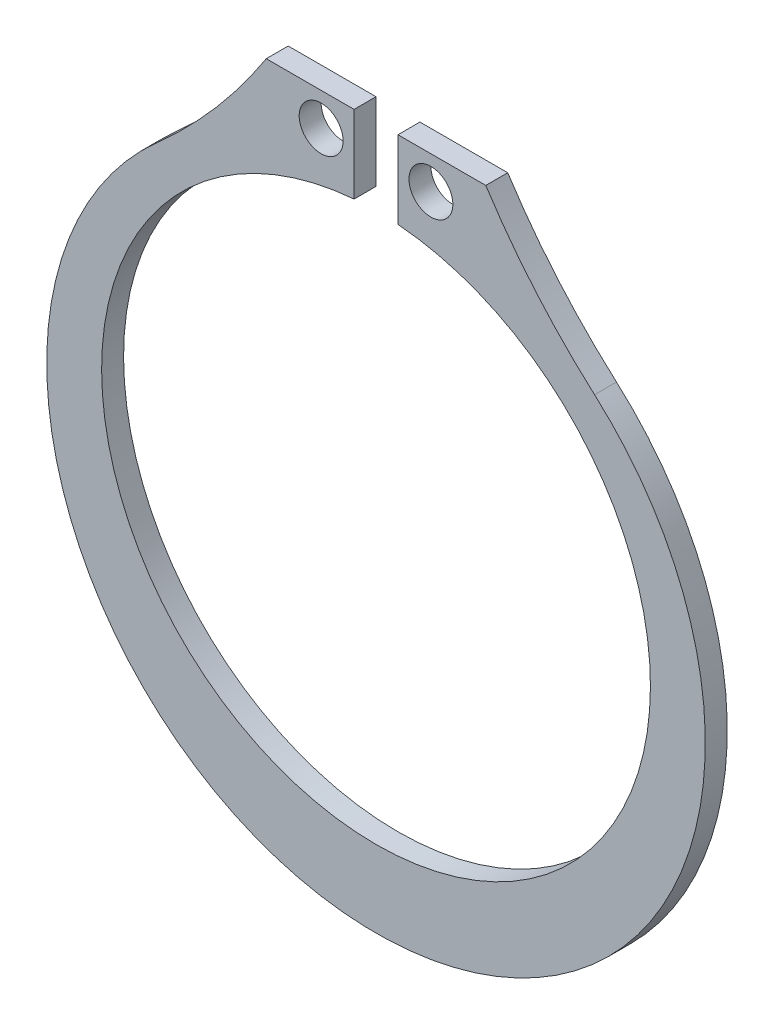
ISO-10303-21;
HEADER;
FILE_DESCRIPTION(('STEP AP214'),'2;1');
FILE_NAME('part.step','',(''),(''),'','','');
FILE_SCHEMA(('AUTOMOTIVE_DESIGN { 1 0 10303 214 1 1 1 1 }'));
ENDSEC;
DATA;
#1=APPLICATION_CONTEXT('core data for automotive mechanical design processes');
#2=APPLICATION_PROTOCOL_DEFINITION('international standard','automotive_design',2000,#1);
#3=PRODUCT_CONTEXT('',#1,'mechanical');
#4=PRODUCT('Part','Part','',(#3));
#5=PRODUCT_RELATED_PRODUCT_CATEGORY('part','',(#4));
#6=PRODUCT_DEFINITION_FORMATION('','',#4);
#7=PRODUCT_DEFINITION_CONTEXT('part definition',#1,'design');
#8=PRODUCT_DEFINITION('design','',#6,#7);
#9=PRODUCT_DEFINITION_SHAPE('','',#8);
#10=(LENGTH_UNIT() NAMED_UNIT(*) SI_UNIT(.MILLI.,.METRE.));
#11=(NAMED_UNIT(*) PLANE_ANGLE_UNIT() SI_UNIT($,.RADIAN.));
#12=(NAMED_UNIT(*) SI_UNIT($,.STERADIAN.) SOLID_ANGLE_UNIT());
#13=UNCERTAINTY_MEASURE_WITH_UNIT(LENGTH_MEASURE(1.E-05),#10,'distance_accuracy_value','');
#14=(GEOMETRIC_REPRESENTATION_CONTEXT(3) GLOBAL_UNCERTAINTY_ASSIGNED_CONTEXT((#13)) GLOBAL_UNIT_ASSIGNED_CONTEXT((#10,
#11,#12)) REPRESENTATION_CONTEXT('',''));
#15=CARTESIAN_POINT('',(0.,0.,0.));
#16=DIRECTION('',(0.,0.,1.));
#17=DIRECTION('',(1.,0.,0.));
#18=AXIS2_PLACEMENT_3D('',#15,#16,#17);
#19=CARTESIAN_POINT('',(-28.5373817339157,32.165475960613,1.));
#20=DIRECTION('',(0.,0.,-1.));
#21=DIRECTION('',(-1.,0.,0.));
#22=AXIS2_PLACEMENT_3D('',#19,#20,#21);
#23=PLANE('',#22);
#24=CARTESIAN_POINT('',(-28.5373817339157,32.165475960613,1.));
#25=DIRECTION('',(0.,0.,-1.));
#26=DIRECTION('',(-1.,0.,0.));
#27=AXIS2_PLACEMENT_3D('',#24,#25,#26);
#28=CIRCLE('',#27,28.);
#29=CARTESIAN_POINT('',(-5.,17.,1.));
#30=VERTEX_POINT('',#29);
#31=CARTESIAN_POINT('',(-9.95490060485432,11.2205148699813,1.));
#32=VERTEX_POINT('',#31);
#33=EDGE_CURVE('E170',#30,#32,#28,.T.);
#34=ORIENTED_EDGE('',*,*,#33,.T.);
#35=CARTESIAN_POINT('',(0.,0.,1.));
#36=DIRECTION('',(0.,0.,1.));
#37=DIRECTION('',(1.,0.,0.));
#38=AXIS2_PLACEMENT_3D('',#35,#36,#37);
#39=CIRCLE('',#38,15.);
#40=CARTESIAN_POINT('',(9.95490060485432,11.2205148699813,1.));
#41=VERTEX_POINT('',#40);
#42=EDGE_CURVE('E106',#32,#41,#39,.T.);
#43=ORIENTED_EDGE('',*,*,#42,.T.);
#44=CARTESIAN_POINT('',(28.5373817339157,32.165475960613,1.));
#45=DIRECTION('',(0.,0.,-1.));
#46=DIRECTION('',(1.,0.,0.));
#47=AXIS2_PLACEMENT_3D('',#44,#45,#46);
#48=CIRCLE('',#47,28.);
#49=CARTESIAN_POINT('',(5.,17.,1.));
#50=VERTEX_POINT('',#49);
#51=EDGE_CURVE('E191',#41,#50,#48,.T.);
#52=ORIENTED_EDGE('',*,*,#51,.T.);
#53=DIRECTION('',(-1.,0.,0.));
#54=VECTOR('',#53,1.);
#55=CARTESIAN_POINT('',(5.,17.,1.));
#56=LINE('',#55,#54);
#57=CARTESIAN_POINT('',(1.,17.,1.));
#58=VERTEX_POINT('',#57);
#59=EDGE_CURVE('E205',#50,#58,#56,.T.);
#60=ORIENTED_EDGE('',*,*,#59,.T.);
#61=DIRECTION('',(0.,-1.,0.));
#62=VECTOR('',#61,1.);
#63=CARTESIAN_POINT('',(1.,17.,1.));
#64=LINE('',#63,#62);
#65=CARTESIAN_POINT('',(0.999999999999999,13.4599357943771,1.));
#66=VERTEX_POINT('',#65);
#67=EDGE_CURVE('E125',#58,#66,#64,.T.);
#68=ORIENTED_EDGE('',*,*,#67,.T.);
#69=CARTESIAN_POINT('',(0.,1.,1.));
#70=DIRECTION('',(0.,0.,-1.));
#71=DIRECTION('',(1.,0.,0.));
#72=AXIS2_PLACEMENT_3D('',#69,#70,#71);
#73=CIRCLE('',#72,12.5);
#74=CARTESIAN_POINT('',(-0.999999999999999,13.4599357943771,1.));
#75=VERTEX_POINT('',#74);
#76=EDGE_CURVE('E119',#66,#75,#73,.T.);
#77=ORIENTED_EDGE('',*,*,#76,.T.);
#78=DIRECTION('',(0.,1.,0.));
#79=VECTOR('',#78,1.);
#80=CARTESIAN_POINT('',(-1.,17.,1.));
#81=LINE('',#80,#79);
#82=CARTESIAN_POINT('',(-1.,17.,1.));
#83=VERTEX_POINT('',#82);
#84=EDGE_CURVE('E123',#75,#83,#81,.T.);
#85=ORIENTED_EDGE('',*,*,#84,.T.);
#86=DIRECTION('',(-1.,0.,0.));
#87=VECTOR('',#86,1.);
#88=CARTESIAN_POINT('',(-5.,17.,1.));
#89=LINE('',#88,#87);
#90=EDGE_CURVE('E63',#83,#30,#89,.T.);
#91=ORIENTED_EDGE('',*,*,#90,.T.);
#92=EDGE_LOOP('',(#34,#43,#52,#60,#68,#77,#85,#91));
#93=FACE_BOUND('',#92,.T.);
#94=CARTESIAN_POINT('',(-2.5,15.5,1.));
#95=DIRECTION('',(0.,0.,1.));
#96=DIRECTION('',(1.,0.,0.));
#97=AXIS2_PLACEMENT_3D('',#94,#95,#96);
#98=CIRCLE('',#97,1.);
#99=CARTESIAN_POINT('',(-1.5,15.5,1.));
#100=VERTEX_POINT('',#99);
#101=EDGE_CURVE('E152',#100,#100,#98,.T.);
#102=ORIENTED_EDGE('',*,*,#101,.F.);
#103=EDGE_LOOP('',(#102));
#104=FACE_BOUND('',#103,.T.);
#105=CARTESIAN_POINT('',(2.5,15.5,1.));
#106=DIRECTION('',(0.,0.,1.));
#107=DIRECTION('',(-1.,0.,0.));
#108=AXIS2_PLACEMENT_3D('',#105,#106,#107);
#109=CIRCLE('',#108,1.);
#110=CARTESIAN_POINT('',(1.5,15.5,1.));
#111=VERTEX_POINT('',#110);
#112=EDGE_CURVE('E219',#111,#111,#109,.T.);
#113=ORIENTED_EDGE('',*,*,#112,.F.);
#114=EDGE_LOOP('',(#113));
#115=FACE_BOUND('',#114,.T.);
#116=ADVANCED_FACE('F45',(#93,#104,#115),#23,.F.);
#117=CARTESIAN_POINT('',(-28.5373817339157,32.165475960613,0.));
#118=DIRECTION('',(0.,0.,-1.));
#119=DIRECTION('',(-1.,0.,0.));
#120=AXIS2_PLACEMENT_3D('',#117,#118,#119);
#121=PLANE('',#120);
#122=CARTESIAN_POINT('',(-2.5,15.5,0.));
#123=DIRECTION('',(0.,0.,1.));
#124=DIRECTION('',(1.,0.,0.));
#125=AXIS2_PLACEMENT_3D('',#122,#123,#124);
#126=CIRCLE('',#125,1.);
#127=CARTESIAN_POINT('',(-1.5,15.5,0.));
#128=VERTEX_POINT('',#127);
#129=EDGE_CURVE('E215',#128,#128,#126,.T.);
#130=ORIENTED_EDGE('',*,*,#129,.T.);
#131=EDGE_LOOP('',(#130));
#132=FACE_BOUND('',#131,.T.);
#133=CARTESIAN_POINT('',(-28.5373817339157,32.165475960613,0.));
#134=DIRECTION('',(0.,0.,-1.));
#135=DIRECTION('',(-1.,0.,0.));
#136=AXIS2_PLACEMENT_3D('',#133,#134,#135);
#137=CIRCLE('',#136,28.);
#138=CARTESIAN_POINT('',(-5.,17.,0.));
#139=VERTEX_POINT('',#138);
#140=CARTESIAN_POINT('',(-9.95490060485432,11.2205148699813,0.));
#141=VERTEX_POINT('',#140);
#142=EDGE_CURVE('E147',#139,#141,#137,.T.);
#143=ORIENTED_EDGE('',*,*,#142,.F.);
#144=DIRECTION('',(-1.,0.,0.));
#145=VECTOR('',#144,1.);
#146=CARTESIAN_POINT('',(-5.,17.,0.));
#147=LINE('',#146,#145);
#148=CARTESIAN_POINT('',(-1.,17.,0.));
#149=VERTEX_POINT('',#148);
#150=EDGE_CURVE('E98',#149,#139,#147,.T.);
#151=ORIENTED_EDGE('',*,*,#150,.F.);
#152=DIRECTION('',(0.,1.,0.));
#153=VECTOR('',#152,1.);
#154=CARTESIAN_POINT('',(-1.,17.,0.));
#155=LINE('',#154,#153);
#156=CARTESIAN_POINT('',(-0.999999999999999,13.4599357943771,0.));
#157=VERTEX_POINT('',#156);
#158=EDGE_CURVE('E92',#157,#149,#155,.T.);
#159=ORIENTED_EDGE('',*,*,#158,.F.);
#160=CARTESIAN_POINT('',(0.,1.,0.));
#161=DIRECTION('',(0.,0.,-1.));
#162=DIRECTION('',(1.,0.,0.));
#163=AXIS2_PLACEMENT_3D('',#160,#161,#162);
#164=CIRCLE('',#163,12.5);
#165=CARTESIAN_POINT('',(0.999999999999999,13.4599357943771,0.));
#166=VERTEX_POINT('',#165);
#167=EDGE_CURVE('E134',#166,#157,#164,.T.);
#168=ORIENTED_EDGE('',*,*,#167,.F.);
#169=DIRECTION('',(0.,-1.,0.));
#170=VECTOR('',#169,1.);
#171=CARTESIAN_POINT('',(1.,17.,0.));
#172=LINE('',#171,#170);
#173=CARTESIAN_POINT('',(1.,17.,0.));
#174=VERTEX_POINT('',#173);
#175=EDGE_CURVE('E161',#174,#166,#172,.T.);
#176=ORIENTED_EDGE('',*,*,#175,.F.);
#177=DIRECTION('',(-1.,0.,0.));
#178=VECTOR('',#177,1.);
#179=CARTESIAN_POINT('',(5.,17.,0.));
#180=LINE('',#179,#178);
#181=CARTESIAN_POINT('',(5.,17.,0.));
#182=VERTEX_POINT('',#181);
#183=EDGE_CURVE('E158',#182,#174,#180,.T.);
#184=ORIENTED_EDGE('',*,*,#183,.F.);
#185=CARTESIAN_POINT('',(28.5373817339157,32.165475960613,0.));
#186=DIRECTION('',(0.,0.,-1.));
#187=DIRECTION('',(1.,0.,0.));
#188=AXIS2_PLACEMENT_3D('',#185,#186,#187);
#189=CIRCLE('',#188,28.);
#190=CARTESIAN_POINT('',(9.95490060485432,11.2205148699813,0.));
#191=VERTEX_POINT('',#190);
#192=EDGE_CURVE('E155',#191,#182,#189,.T.);
#193=ORIENTED_EDGE('',*,*,#192,.F.);
#194=CARTESIAN_POINT('',(0.,0.,0.));
#195=DIRECTION('',(0.,0.,1.));
#196=DIRECTION('',(1.,0.,0.));
#197=AXIS2_PLACEMENT_3D('',#194,#195,#196);
#198=CIRCLE('',#197,15.);
#199=EDGE_CURVE('E151',#141,#191,#198,.T.);
#200=ORIENTED_EDGE('',*,*,#199,.F.);
#201=EDGE_LOOP('',(#143,#151,#159,#168,#176,#184,#193,#200));
#202=FACE_BOUND('',#201,.T.);
#203=CARTESIAN_POINT('',(2.5,15.5,0.));
#204=DIRECTION('',(0.,0.,1.));
#205=DIRECTION('',(-1.,0.,0.));
#206=AXIS2_PLACEMENT_3D('',#203,#204,#205);
#207=CIRCLE('',#206,1.);
#208=CARTESIAN_POINT('',(1.5,15.5,0.));
#209=VERTEX_POINT('',#208);
#210=EDGE_CURVE('E223',#209,#209,#207,.T.);
#211=ORIENTED_EDGE('',*,*,#210,.T.);
#212=EDGE_LOOP('',(#211));
#213=FACE_BOUND('',#212,.T.);
#214=ADVANCED_FACE('F195',(#132,#202,#213),#121,.T.);
#215=CARTESIAN_POINT('',(-28.5373817339157,32.165475960613,1.));
#216=DIRECTION('',(0.,0.,-1.));
#217=DIRECTION('',(-1.,0.,0.));
#218=AXIS2_PLACEMENT_3D('',#215,#216,#217);
#219=CYLINDRICAL_SURFACE('',#218,28.);
#220=ORIENTED_EDGE('',*,*,#142,.T.);
#221=DIRECTION('',(0.,0.,-1.));
#222=VECTOR('',#221,1.);
#223=CARTESIAN_POINT('',(-9.95490060485432,11.2205148699813,1.));
#224=LINE('',#223,#222);
#225=EDGE_CURVE('E11',#32,#141,#224,.T.);
#226=ORIENTED_EDGE('',*,*,#225,.F.);
#227=ORIENTED_EDGE('',*,*,#33,.F.);
#228=DIRECTION('',(0.,0.,-1.));
#229=VECTOR('',#228,1.);
#230=CARTESIAN_POINT('',(-5.,17.,1.));
#231=LINE('',#230,#229);
#232=EDGE_CURVE('E143',#30,#139,#231,.T.);
#233=ORIENTED_EDGE('',*,*,#232,.T.);
#234=EDGE_LOOP('',(#220,#226,#227,#233));
#235=FACE_BOUND('',#234,.T.);
#236=ADVANCED_FACE('F47',(#235),#219,.F.);
#237=CARTESIAN_POINT('',(0.,0.,1.));
#238=DIRECTION('',(0.,0.,-1.));
#239=DIRECTION('',(-1.,0.,0.));
#240=AXIS2_PLACEMENT_3D('',#237,#238,#239);
#241=CYLINDRICAL_SURFACE('',#240,15.);
#242=ORIENTED_EDGE('',*,*,#199,.T.);
#243=DIRECTION('',(0.,0.,-1.));
#244=VECTOR('',#243,1.);
#245=CARTESIAN_POINT('',(9.95490060485432,11.2205148699813,1.));
#246=LINE('',#245,#244);
#247=EDGE_CURVE('E55',#41,#191,#246,.T.);
#248=ORIENTED_EDGE('',*,*,#247,.F.);
#249=ORIENTED_EDGE('',*,*,#42,.F.);
#250=ORIENTED_EDGE('',*,*,#225,.T.);
#251=EDGE_LOOP('',(#242,#248,#249,#250));
#252=FACE_BOUND('',#251,.T.);
#253=ADVANCED_FACE('F257',(#252),#241,.T.);
#254=CARTESIAN_POINT('',(28.5373817339157,32.165475960613,1.));
#255=DIRECTION('',(0.,0.,-1.));
#256=DIRECTION('',(-1.,0.,0.));
#257=AXIS2_PLACEMENT_3D('',#254,#255,#256);
#258=CYLINDRICAL_SURFACE('',#257,28.);
#259=ORIENTED_EDGE('',*,*,#192,.T.);
#260=DIRECTION('',(0.,0.,-1.));
#261=VECTOR('',#260,1.);
#262=CARTESIAN_POINT('',(5.,17.,1.));
#263=LINE('',#262,#261);
#264=EDGE_CURVE('E181',#50,#182,#263,.T.);
#265=ORIENTED_EDGE('',*,*,#264,.F.);
#266=ORIENTED_EDGE('',*,*,#51,.F.);
#267=ORIENTED_EDGE('',*,*,#247,.T.);
#268=EDGE_LOOP('',(#259,#265,#266,#267));
#269=FACE_BOUND('',#268,.T.);
#270=ADVANCED_FACE('F189',(#269),#258,.F.);
#271=CARTESIAN_POINT('',(5.,17.,1.));
#272=DIRECTION('',(0.,-1.,0.));
#273=DIRECTION('',(0.,0.,-1.));
#274=AXIS2_PLACEMENT_3D('',#271,#272,#273);
#275=PLANE('',#274);
#276=ORIENTED_EDGE('',*,*,#183,.T.);
#277=DIRECTION('',(0.,0.,-1.));
#278=VECTOR('',#277,1.);
#279=CARTESIAN_POINT('',(1.,17.,1.));
#280=LINE('',#279,#278);
#281=EDGE_CURVE('E177',#58,#174,#280,.T.);
#282=ORIENTED_EDGE('',*,*,#281,.F.);
#283=ORIENTED_EDGE('',*,*,#59,.F.);
#284=ORIENTED_EDGE('',*,*,#264,.T.);
#285=EDGE_LOOP('',(#276,#282,#283,#284));
#286=FACE_BOUND('',#285,.T.);
#287=ADVANCED_FACE('F200',(#286),#275,.F.);
#288=CARTESIAN_POINT('',(1.,17.,1.));
#289=DIRECTION('',(1.,0.,0.));
#290=DIRECTION('',(0.,1.,0.));
#291=AXIS2_PLACEMENT_3D('',#288,#289,#290);
#292=PLANE('',#291);
#293=ORIENTED_EDGE('',*,*,#175,.T.);
#294=DIRECTION('',(0.,0.,-1.));
#295=VECTOR('',#294,1.);
#296=CARTESIAN_POINT('',(0.999999999999999,13.4599357943771,1.));
#297=LINE('',#296,#295);
#298=EDGE_CURVE('E136',#66,#166,#297,.T.);
#299=ORIENTED_EDGE('',*,*,#298,.F.);
#300=ORIENTED_EDGE('',*,*,#67,.F.);
#301=ORIENTED_EDGE('',*,*,#281,.T.);
#302=EDGE_LOOP('',(#293,#299,#300,#301));
#303=FACE_BOUND('',#302,.T.);
#304=ADVANCED_FACE('F203',(#303),#292,.F.);
#305=CARTESIAN_POINT('',(0.,1.,1.));
#306=DIRECTION('',(0.,0.,-1.));
#307=DIRECTION('',(-1.,0.,0.));
#308=AXIS2_PLACEMENT_3D('',#305,#306,#307);
#309=CYLINDRICAL_SURFACE('',#308,12.5);
#310=ORIENTED_EDGE('',*,*,#167,.T.);
#311=DIRECTION('',(0.,0.,-1.));
#312=VECTOR('',#311,1.);
#313=CARTESIAN_POINT('',(-0.999999999999999,13.4599357943771,1.));
#314=LINE('',#313,#312);
#315=EDGE_CURVE('E131',#75,#157,#314,.T.);
#316=ORIENTED_EDGE('',*,*,#315,.F.);
#317=ORIENTED_EDGE('',*,*,#76,.F.);
#318=ORIENTED_EDGE('',*,*,#298,.T.);
#319=EDGE_LOOP('',(#310,#316,#317,#318));
#320=FACE_BOUND('',#319,.T.);
#321=ADVANCED_FACE('F132',(#320),#309,.F.);
#322=CARTESIAN_POINT('',(-1.,17.,1.));
#323=DIRECTION('',(-1.,0.,0.));
#324=DIRECTION('',(0.,-1.,0.));
#325=AXIS2_PLACEMENT_3D('',#322,#323,#324);
#326=PLANE('',#325);
#327=ORIENTED_EDGE('',*,*,#158,.T.);
#328=DIRECTION('',(0.,0.,-1.));
#329=VECTOR('',#328,1.);
#330=CARTESIAN_POINT('',(-1.,17.,1.));
#331=LINE('',#330,#329);
#332=EDGE_CURVE('E137',#83,#149,#331,.T.);
#333=ORIENTED_EDGE('',*,*,#332,.F.);
#334=ORIENTED_EDGE('',*,*,#84,.F.);
#335=ORIENTED_EDGE('',*,*,#315,.T.);
#336=EDGE_LOOP('',(#327,#333,#334,#335));
#337=FACE_BOUND('',#336,.T.);
#338=ADVANCED_FACE('F139',(#337),#326,.F.);
#339=CARTESIAN_POINT('',(-5.,17.,1.));
#340=DIRECTION('',(0.,-1.,0.));
#341=DIRECTION('',(0.,0.,-1.));
#342=AXIS2_PLACEMENT_3D('',#339,#340,#341);
#343=PLANE('',#342);
#344=ORIENTED_EDGE('',*,*,#150,.T.);
#345=ORIENTED_EDGE('',*,*,#232,.F.);
#346=ORIENTED_EDGE('',*,*,#90,.F.);
#347=ORIENTED_EDGE('',*,*,#332,.T.);
#348=EDGE_LOOP('',(#344,#345,#346,#347));
#349=FACE_BOUND('',#348,.T.);
#350=ADVANCED_FACE('F245',(#349),#343,.F.);
#351=CARTESIAN_POINT('',(-2.5,15.5,1.));
#352=DIRECTION('',(0.,0.,-1.));
#353=DIRECTION('',(-1.,0.,0.));
#354=AXIS2_PLACEMENT_3D('',#351,#352,#353);
#355=CYLINDRICAL_SURFACE('',#354,1.);
#356=ORIENTED_EDGE('',*,*,#101,.T.);
#357=EDGE_LOOP('',(#356));
#358=FACE_BOUND('',#357,.T.);
#359=ORIENTED_EDGE('',*,*,#129,.F.);
#360=EDGE_LOOP('',(#359));
#361=FACE_BOUND('',#360,.T.);
#362=ADVANCED_FACE('F242',(#358,#361),#355,.F.);
#363=CARTESIAN_POINT('',(2.5,15.5,1.));
#364=DIRECTION('',(0.,0.,-1.));
#365=DIRECTION('',(-1.,0.,0.));
#366=AXIS2_PLACEMENT_3D('',#363,#364,#365);
#367=CYLINDRICAL_SURFACE('',#366,1.);
#368=ORIENTED_EDGE('',*,*,#112,.T.);
#369=EDGE_LOOP('',(#368));
#370=FACE_BOUND('',#369,.T.);
#371=ORIENTED_EDGE('',*,*,#210,.F.);
#372=EDGE_LOOP('',(#371));
#373=FACE_BOUND('',#372,.T.);
#374=ADVANCED_FACE('F231',(#370,#373),#367,.F.);
#375=CLOSED_SHELL('',(#116,#214,#236,#253,#270,#287,#304,#321,#338,#350,#362,#374));
#376=MANIFOLD_SOLID_BREP('B2',#375);
#377=ADVANCED_BREP_SHAPE_REPRESENTATION('',(#18,#376),#14);
#378=SHAPE_DEFINITION_REPRESENTATION(#9,#377);
ENDSEC;
END-ISO-10303-21;
